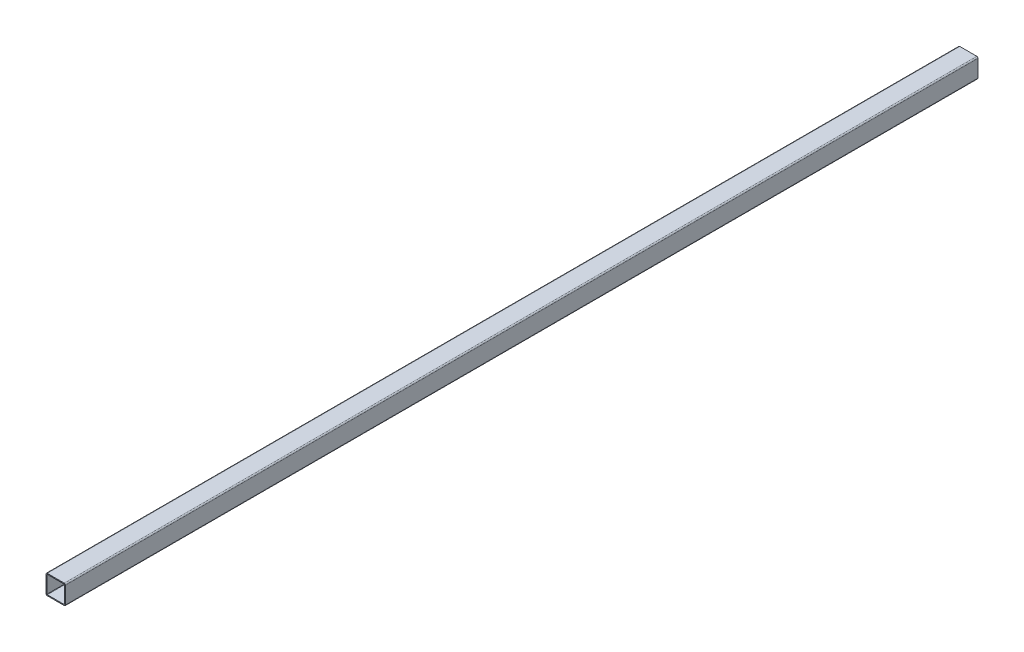
ISO-10303-21;
HEADER;
FILE_DESCRIPTION(('STEP AP214'),'2;1');
FILE_NAME('part.step','',(''),(''),'','','');
FILE_SCHEMA(('AUTOMOTIVE_DESIGN { 1 0 10303 214 1 1 1 1 }'));
ENDSEC;
DATA;
#1=APPLICATION_CONTEXT('core data for automotive mechanical design processes');
#2=APPLICATION_PROTOCOL_DEFINITION('international standard','automotive_design',2000,#1);
#3=PRODUCT_CONTEXT('',#1,'mechanical');
#4=PRODUCT('Part','Part','',(#3));
#5=PRODUCT_RELATED_PRODUCT_CATEGORY('part','',(#4));
#6=PRODUCT_DEFINITION_FORMATION('','',#4);
#7=PRODUCT_DEFINITION_CONTEXT('part definition',#1,'design');
#8=PRODUCT_DEFINITION('design','',#6,#7);
#9=PRODUCT_DEFINITION_SHAPE('','',#8);
#10=(LENGTH_UNIT() NAMED_UNIT(*) SI_UNIT(.MILLI.,.METRE.));
#11=(NAMED_UNIT(*) PLANE_ANGLE_UNIT() SI_UNIT($,.RADIAN.));
#12=(NAMED_UNIT(*) SI_UNIT($,.STERADIAN.) SOLID_ANGLE_UNIT());
#13=UNCERTAINTY_MEASURE_WITH_UNIT(LENGTH_MEASURE(1.E-05),#10,'distance_accuracy_value','');
#14=(GEOMETRIC_REPRESENTATION_CONTEXT(3) GLOBAL_UNCERTAINTY_ASSIGNED_CONTEXT((#13)) GLOBAL_UNIT_ASSIGNED_CONTEXT((#10,
#11,#12)) REPRESENTATION_CONTEXT('',''));
#15=CARTESIAN_POINT('',(0.,0.,0.));
#16=DIRECTION('',(0.,0.,1.));
#17=DIRECTION('',(1.,0.,0.));
#18=AXIS2_PLACEMENT_3D('',#15,#16,#17);
#19=CARTESIAN_POINT('',(14.,-14.,-750.));
#20=DIRECTION('',(0.,0.,1.));
#21=DIRECTION('',(1.,0.,0.));
#22=AXIS2_PLACEMENT_3D('',#19,#20,#21);
#23=CYLINDRICAL_SURFACE('',#22,2.);
#24=DIRECTION('',(0.,0.,1.));
#25=VECTOR('',#24,1.);
#26=CARTESIAN_POINT('',(16.,-14.,-750.));
#27=LINE('',#26,#25);
#28=CARTESIAN_POINT('',(16.,-14.,-750.));
#29=VERTEX_POINT('',#28);
#30=CARTESIAN_POINT('',(16.,-14.,750.));
#31=VERTEX_POINT('',#30);
#32=EDGE_CURVE('E42',#29,#31,#27,.T.);
#33=ORIENTED_EDGE('',*,*,#32,.T.);
#34=CARTESIAN_POINT('',(14.,-14.,750.));
#35=DIRECTION('',(0.,0.,1.));
#36=DIRECTION('',(1.,0.,0.));
#37=AXIS2_PLACEMENT_3D('',#34,#35,#36);
#38=CIRCLE('',#37,2.);
#39=CARTESIAN_POINT('',(14.,-16.,750.));
#40=VERTEX_POINT('',#39);
#41=EDGE_CURVE('E205',#40,#31,#38,.T.);
#42=ORIENTED_EDGE('',*,*,#41,.F.);
#43=DIRECTION('',(0.,0.,1.));
#44=VECTOR('',#43,1.);
#45=CARTESIAN_POINT('',(14.,-16.,-750.));
#46=LINE('',#45,#44);
#47=CARTESIAN_POINT('',(14.,-16.,-750.));
#48=VERTEX_POINT('',#47);
#49=EDGE_CURVE('E11',#48,#40,#46,.T.);
#50=ORIENTED_EDGE('',*,*,#49,.F.);
#51=CARTESIAN_POINT('',(14.,-14.,-750.));
#52=DIRECTION('',(0.,0.,1.));
#53=DIRECTION('',(1.,0.,0.));
#54=AXIS2_PLACEMENT_3D('',#51,#52,#53);
#55=CIRCLE('',#54,2.);
#56=EDGE_CURVE('E265',#48,#29,#55,.T.);
#57=ORIENTED_EDGE('',*,*,#56,.T.);
#58=EDGE_LOOP('',(#33,#42,#50,#57));
#59=FACE_BOUND('',#58,.T.);
#60=ADVANCED_FACE('F39',(#59),#23,.T.);
#61=CARTESIAN_POINT('',(-14.,-16.,-750.));
#62=DIRECTION('',(0.,-1.,0.));
#63=DIRECTION('',(0.,0.,-1.));
#64=AXIS2_PLACEMENT_3D('',#61,#62,#63);
#65=PLANE('',#64);
#66=ORIENTED_EDGE('',*,*,#49,.T.);
#67=DIRECTION('',(1.,0.,0.));
#68=VECTOR('',#67,1.);
#69=CARTESIAN_POINT('',(-14.,-16.,750.));
#70=LINE('',#69,#68);
#71=CARTESIAN_POINT('',(-14.,-16.,750.));
#72=VERTEX_POINT('',#71);
#73=EDGE_CURVE('E233',#72,#40,#70,.T.);
#74=ORIENTED_EDGE('',*,*,#73,.F.);
#75=DIRECTION('',(0.,0.,1.));
#76=VECTOR('',#75,1.);
#77=CARTESIAN_POINT('',(-14.,-16.,-750.));
#78=LINE('',#77,#76);
#79=CARTESIAN_POINT('',(-14.,-16.,-750.));
#80=VERTEX_POINT('',#79);
#81=EDGE_CURVE('E48',#80,#72,#78,.T.);
#82=ORIENTED_EDGE('',*,*,#81,.F.);
#83=DIRECTION('',(1.,0.,0.));
#84=VECTOR('',#83,1.);
#85=CARTESIAN_POINT('',(-14.,-16.,-750.));
#86=LINE('',#85,#84);
#87=EDGE_CURVE('E309',#80,#48,#86,.T.);
#88=ORIENTED_EDGE('',*,*,#87,.T.);
#89=EDGE_LOOP('',(#66,#74,#82,#88));
#90=FACE_BOUND('',#89,.T.);
#91=ADVANCED_FACE('F338',(#90),#65,.T.);
#92=CARTESIAN_POINT('',(-14.,-14.,-750.));
#93=DIRECTION('',(0.,0.,1.));
#94=DIRECTION('',(1.,0.,0.));
#95=AXIS2_PLACEMENT_3D('',#92,#93,#94);
#96=CYLINDRICAL_SURFACE('',#95,2.);
#97=ORIENTED_EDGE('',*,*,#81,.T.);
#98=CARTESIAN_POINT('',(-14.,-14.,750.));
#99=DIRECTION('',(0.,0.,1.));
#100=DIRECTION('',(1.,0.,0.));
#101=AXIS2_PLACEMENT_3D('',#98,#99,#100);
#102=CIRCLE('',#101,2.);
#103=CARTESIAN_POINT('',(-16.,-14.,750.));
#104=VERTEX_POINT('',#103);
#105=EDGE_CURVE('E229',#104,#72,#102,.T.);
#106=ORIENTED_EDGE('',*,*,#105,.F.);
#107=DIRECTION('',(0.,0.,1.));
#108=VECTOR('',#107,1.);
#109=CARTESIAN_POINT('',(-16.,-14.,-750.));
#110=LINE('',#109,#108);
#111=CARTESIAN_POINT('',(-16.,-14.,-750.));
#112=VERTEX_POINT('',#111);
#113=EDGE_CURVE('E315',#112,#104,#110,.T.);
#114=ORIENTED_EDGE('',*,*,#113,.F.);
#115=CARTESIAN_POINT('',(-14.,-14.,-750.));
#116=DIRECTION('',(0.,0.,1.));
#117=DIRECTION('',(1.,0.,0.));
#118=AXIS2_PLACEMENT_3D('',#115,#116,#117);
#119=CIRCLE('',#118,2.);
#120=EDGE_CURVE('E305',#112,#80,#119,.T.);
#121=ORIENTED_EDGE('',*,*,#120,.T.);
#122=EDGE_LOOP('',(#97,#106,#114,#121));
#123=FACE_BOUND('',#122,.T.);
#124=ADVANCED_FACE('F359',(#123),#96,.T.);
#125=CARTESIAN_POINT('',(-16.,-14.,-750.));
#126=DIRECTION('',(-1.,0.,0.));
#127=DIRECTION('',(0.,0.,1.));
#128=AXIS2_PLACEMENT_3D('',#125,#126,#127);
#129=PLANE('',#128);
#130=ORIENTED_EDGE('',*,*,#113,.T.);
#131=DIRECTION('',(0.,-1.,0.));
#132=VECTOR('',#131,1.);
#133=CARTESIAN_POINT('',(-16.,-14.,750.));
#134=LINE('',#133,#132);
#135=CARTESIAN_POINT('',(-16.,14.,750.));
#136=VERTEX_POINT('',#135);
#137=EDGE_CURVE('E225',#136,#104,#134,.T.);
#138=ORIENTED_EDGE('',*,*,#137,.F.);
#139=DIRECTION('',(0.,0.,1.));
#140=VECTOR('',#139,1.);
#141=CARTESIAN_POINT('',(-16.,14.,-750.));
#142=LINE('',#141,#140);
#143=CARTESIAN_POINT('',(-16.,14.,-750.));
#144=VERTEX_POINT('',#143);
#145=EDGE_CURVE('E318',#144,#136,#142,.T.);
#146=ORIENTED_EDGE('',*,*,#145,.F.);
#147=DIRECTION('',(0.,-1.,0.));
#148=VECTOR('',#147,1.);
#149=CARTESIAN_POINT('',(-16.,-14.,-750.));
#150=LINE('',#149,#148);
#151=EDGE_CURVE('E301',#144,#112,#150,.T.);
#152=ORIENTED_EDGE('',*,*,#151,.T.);
#153=EDGE_LOOP('',(#130,#138,#146,#152));
#154=FACE_BOUND('',#153,.T.);
#155=ADVANCED_FACE('F356',(#154),#129,.T.);
#156=CARTESIAN_POINT('',(-14.,14.,-750.));
#157=DIRECTION('',(0.,0.,1.));
#158=DIRECTION('',(1.,0.,0.));
#159=AXIS2_PLACEMENT_3D('',#156,#157,#158);
#160=CYLINDRICAL_SURFACE('',#159,2.);
#161=ORIENTED_EDGE('',*,*,#145,.T.);
#162=CARTESIAN_POINT('',(-14.,14.,750.));
#163=DIRECTION('',(0.,0.,1.));
#164=DIRECTION('',(-1.,0.,0.));
#165=AXIS2_PLACEMENT_3D('',#162,#163,#164);
#166=CIRCLE('',#165,2.);
#167=CARTESIAN_POINT('',(-14.,16.,750.));
#168=VERTEX_POINT('',#167);
#169=EDGE_CURVE('E221',#168,#136,#166,.T.);
#170=ORIENTED_EDGE('',*,*,#169,.F.);
#171=DIRECTION('',(0.,0.,1.));
#172=VECTOR('',#171,1.);
#173=CARTESIAN_POINT('',(-14.,16.,-750.));
#174=LINE('',#173,#172);
#175=CARTESIAN_POINT('',(-14.,16.,-750.));
#176=VERTEX_POINT('',#175);
#177=EDGE_CURVE('E321',#176,#168,#174,.T.);
#178=ORIENTED_EDGE('',*,*,#177,.F.);
#179=CARTESIAN_POINT('',(-14.,14.,-750.));
#180=DIRECTION('',(0.,0.,1.));
#181=DIRECTION('',(-1.,0.,0.));
#182=AXIS2_PLACEMENT_3D('',#179,#180,#181);
#183=CIRCLE('',#182,2.);
#184=EDGE_CURVE('E297',#176,#144,#183,.T.);
#185=ORIENTED_EDGE('',*,*,#184,.T.);
#186=EDGE_LOOP('',(#161,#170,#178,#185));
#187=FACE_BOUND('',#186,.T.);
#188=ADVANCED_FACE('F354',(#187),#160,.T.);
#189=CARTESIAN_POINT('',(-14.,16.,-750.));
#190=DIRECTION('',(0.,1.,0.));
#191=DIRECTION('',(0.,0.,1.));
#192=AXIS2_PLACEMENT_3D('',#189,#190,#191);
#193=PLANE('',#192);
#194=ORIENTED_EDGE('',*,*,#177,.T.);
#195=DIRECTION('',(-1.,0.,0.));
#196=VECTOR('',#195,1.);
#197=CARTESIAN_POINT('',(-14.,16.,750.));
#198=LINE('',#197,#196);
#199=CARTESIAN_POINT('',(14.,16.,750.));
#200=VERTEX_POINT('',#199);
#201=EDGE_CURVE('E217',#200,#168,#198,.T.);
#202=ORIENTED_EDGE('',*,*,#201,.F.);
#203=DIRECTION('',(0.,0.,1.));
#204=VECTOR('',#203,1.);
#205=CARTESIAN_POINT('',(14.,16.,-750.));
#206=LINE('',#205,#204);
#207=CARTESIAN_POINT('',(14.,16.,-750.));
#208=VERTEX_POINT('',#207);
#209=EDGE_CURVE('E324',#208,#200,#206,.T.);
#210=ORIENTED_EDGE('',*,*,#209,.F.);
#211=DIRECTION('',(-1.,0.,0.));
#212=VECTOR('',#211,1.);
#213=CARTESIAN_POINT('',(-14.,16.,-750.));
#214=LINE('',#213,#212);
#215=EDGE_CURVE('E293',#208,#176,#214,.T.);
#216=ORIENTED_EDGE('',*,*,#215,.T.);
#217=EDGE_LOOP('',(#194,#202,#210,#216));
#218=FACE_BOUND('',#217,.T.);
#219=ADVANCED_FACE('F352',(#218),#193,.T.);
#220=CARTESIAN_POINT('',(14.,14.,-750.));
#221=DIRECTION('',(0.,0.,1.));
#222=DIRECTION('',(1.,0.,0.));
#223=AXIS2_PLACEMENT_3D('',#220,#221,#222);
#224=CYLINDRICAL_SURFACE('',#223,2.);
#225=ORIENTED_EDGE('',*,*,#209,.T.);
#226=CARTESIAN_POINT('',(14.,14.,750.));
#227=DIRECTION('',(0.,0.,1.));
#228=DIRECTION('',(1.,0.,0.));
#229=AXIS2_PLACEMENT_3D('',#226,#227,#228);
#230=CIRCLE('',#229,2.);
#231=CARTESIAN_POINT('',(16.,14.,750.));
#232=VERTEX_POINT('',#231);
#233=EDGE_CURVE('E213',#232,#200,#230,.T.);
#234=ORIENTED_EDGE('',*,*,#233,.F.);
#235=DIRECTION('',(0.,0.,1.));
#236=VECTOR('',#235,1.);
#237=CARTESIAN_POINT('',(16.,14.,-750.));
#238=LINE('',#237,#236);
#239=CARTESIAN_POINT('',(16.,14.,-750.));
#240=VERTEX_POINT('',#239);
#241=EDGE_CURVE('E326',#240,#232,#238,.T.);
#242=ORIENTED_EDGE('',*,*,#241,.F.);
#243=CARTESIAN_POINT('',(14.,14.,-750.));
#244=DIRECTION('',(0.,0.,1.));
#245=DIRECTION('',(1.,0.,0.));
#246=AXIS2_PLACEMENT_3D('',#243,#244,#245);
#247=CIRCLE('',#246,2.);
#248=EDGE_CURVE('E289',#240,#208,#247,.T.);
#249=ORIENTED_EDGE('',*,*,#248,.T.);
#250=EDGE_LOOP('',(#225,#234,#242,#249));
#251=FACE_BOUND('',#250,.T.);
#252=ADVANCED_FACE('F348',(#251),#224,.T.);
#253=CARTESIAN_POINT('',(16.,-14.,-750.));
#254=DIRECTION('',(1.,0.,0.));
#255=DIRECTION('',(0.,0.,-1.));
#256=AXIS2_PLACEMENT_3D('',#253,#254,#255);
#257=PLANE('',#256);
#258=ORIENTED_EDGE('',*,*,#241,.T.);
#259=DIRECTION('',(0.,1.,0.));
#260=VECTOR('',#259,1.);
#261=CARTESIAN_POINT('',(16.,-14.,750.));
#262=LINE('',#261,#260);
#263=EDGE_CURVE('E209',#31,#232,#262,.T.);
#264=ORIENTED_EDGE('',*,*,#263,.F.);
#265=ORIENTED_EDGE('',*,*,#32,.F.);
#266=DIRECTION('',(0.,1.,0.));
#267=VECTOR('',#266,1.);
#268=CARTESIAN_POINT('',(16.,-14.,-750.));
#269=LINE('',#268,#267);
#270=EDGE_CURVE('E285',#29,#240,#269,.T.);
#271=ORIENTED_EDGE('',*,*,#270,.T.);
#272=EDGE_LOOP('',(#258,#264,#265,#271));
#273=FACE_BOUND('',#272,.T.);
#274=ADVANCED_FACE('F332',(#273),#257,.T.);
#275=CARTESIAN_POINT('',(14.,-14.,-750.));
#276=DIRECTION('',(0.,0.,1.));
#277=DIRECTION('',(1.,0.,0.));
#278=AXIS2_PLACEMENT_3D('',#275,#276,#277);
#279=PLANE('',#278);
#280=DIRECTION('',(-1.,0.,0.));
#281=VECTOR('',#280,1.);
#282=CARTESIAN_POINT('',(-14.,14.48,-750.));
#283=LINE('',#282,#281);
#284=CARTESIAN_POINT('',(14.,14.48,-750.));
#285=VERTEX_POINT('',#284);
#286=CARTESIAN_POINT('',(-14.,14.48,-750.));
#287=VERTEX_POINT('',#286);
#288=EDGE_CURVE('E166',#285,#287,#283,.T.);
#289=ORIENTED_EDGE('',*,*,#288,.T.);
#290=CARTESIAN_POINT('',(-14.,14.,-750.));
#291=DIRECTION('',(0.,0.,1.));
#292=DIRECTION('',(-1.,0.,0.));
#293=AXIS2_PLACEMENT_3D('',#290,#291,#292);
#294=CIRCLE('',#293,0.48);
#295=CARTESIAN_POINT('',(-14.48,14.,-750.));
#296=VERTEX_POINT('',#295);
#297=EDGE_CURVE('E237',#287,#296,#294,.T.);
#298=ORIENTED_EDGE('',*,*,#297,.T.);
#299=DIRECTION('',(0.,-1.,0.));
#300=VECTOR('',#299,1.);
#301=CARTESIAN_POINT('',(-14.48,-14.,-750.));
#302=LINE('',#301,#300);
#303=CARTESIAN_POINT('',(-14.48,-14.,-750.));
#304=VERTEX_POINT('',#303);
#305=EDGE_CURVE('E160',#296,#304,#302,.T.);
#306=ORIENTED_EDGE('',*,*,#305,.T.);
#307=CARTESIAN_POINT('',(-14.,-14.,-750.));
#308=DIRECTION('',(0.,0.,1.));
#309=DIRECTION('',(1.,0.,0.));
#310=AXIS2_PLACEMENT_3D('',#307,#308,#309);
#311=CIRCLE('',#310,0.48);
#312=CARTESIAN_POINT('',(-14.,-14.48,-750.));
#313=VERTEX_POINT('',#312);
#314=EDGE_CURVE('E56',#304,#313,#311,.T.);
#315=ORIENTED_EDGE('',*,*,#314,.T.);
#316=DIRECTION('',(1.,0.,0.));
#317=VECTOR('',#316,1.);
#318=CARTESIAN_POINT('',(-14.,-14.48,-750.));
#319=LINE('',#318,#317);
#320=CARTESIAN_POINT('',(14.,-14.48,-750.));
#321=VERTEX_POINT('',#320);
#322=EDGE_CURVE('E244',#313,#321,#319,.T.);
#323=ORIENTED_EDGE('',*,*,#322,.T.);
#324=CARTESIAN_POINT('',(14.,-14.,-750.));
#325=DIRECTION('',(0.,0.,1.));
#326=DIRECTION('',(1.,0.,0.));
#327=AXIS2_PLACEMENT_3D('',#324,#325,#326);
#328=CIRCLE('',#327,0.48);
#329=CARTESIAN_POINT('',(14.48,-14.,-750.));
#330=VERTEX_POINT('',#329);
#331=EDGE_CURVE('E248',#321,#330,#328,.T.);
#332=ORIENTED_EDGE('',*,*,#331,.T.);
#333=DIRECTION('',(0.,1.,0.));
#334=VECTOR('',#333,1.);
#335=CARTESIAN_POINT('',(14.48,-14.,-750.));
#336=LINE('',#335,#334);
#337=CARTESIAN_POINT('',(14.48,14.,-750.));
#338=VERTEX_POINT('',#337);
#339=EDGE_CURVE('E252',#330,#338,#336,.T.);
#340=ORIENTED_EDGE('',*,*,#339,.T.);
#341=CARTESIAN_POINT('',(14.,14.,-750.));
#342=DIRECTION('',(0.,0.,1.));
#343=DIRECTION('',(1.,0.,0.));
#344=AXIS2_PLACEMENT_3D('',#341,#342,#343);
#345=CIRCLE('',#344,0.48);
#346=EDGE_CURVE('E256',#338,#285,#345,.T.);
#347=ORIENTED_EDGE('',*,*,#346,.T.);
#348=EDGE_LOOP('',(#289,#298,#306,#315,#323,#332,#340,#347));
#349=FACE_BOUND('',#348,.T.);
#350=ORIENTED_EDGE('',*,*,#56,.F.);
#351=ORIENTED_EDGE('',*,*,#87,.F.);
#352=ORIENTED_EDGE('',*,*,#120,.F.);
#353=ORIENTED_EDGE('',*,*,#151,.F.);
#354=ORIENTED_EDGE('',*,*,#184,.F.);
#355=ORIENTED_EDGE('',*,*,#215,.F.);
#356=ORIENTED_EDGE('',*,*,#248,.F.);
#357=ORIENTED_EDGE('',*,*,#270,.F.);
#358=EDGE_LOOP('',(#350,#351,#352,#353,#354,#355,#356,#357));
#359=FACE_BOUND('',#358,.T.);
#360=ADVANCED_FACE('F342',(#349,#359),#279,.F.);
#361=CARTESIAN_POINT('',(-14.,14.,-750.));
#362=DIRECTION('',(0.,0.,1.));
#363=DIRECTION('',(1.,0.,0.));
#364=AXIS2_PLACEMENT_3D('',#361,#362,#363);
#365=CYLINDRICAL_SURFACE('',#364,0.48);
#366=DIRECTION('',(0.,0.,1.));
#367=VECTOR('',#366,1.);
#368=CARTESIAN_POINT('',(-14.,14.48,-750.));
#369=LINE('',#368,#367);
#370=CARTESIAN_POINT('',(-14.,14.48,750.));
#371=VERTEX_POINT('',#370);
#372=EDGE_CURVE('E171',#287,#371,#369,.T.);
#373=ORIENTED_EDGE('',*,*,#372,.T.);
#374=CARTESIAN_POINT('',(-14.,14.,750.));
#375=DIRECTION('',(0.,0.,1.));
#376=DIRECTION('',(-1.,0.,0.));
#377=AXIS2_PLACEMENT_3D('',#374,#375,#376);
#378=CIRCLE('',#377,0.48);
#379=CARTESIAN_POINT('',(-14.48,14.,750.));
#380=VERTEX_POINT('',#379);
#381=EDGE_CURVE('E169',#371,#380,#378,.T.);
#382=ORIENTED_EDGE('',*,*,#381,.T.);
#383=DIRECTION('',(0.,0.,1.));
#384=VECTOR('',#383,1.);
#385=CARTESIAN_POINT('',(-14.48,14.,-750.));
#386=LINE('',#385,#384);
#387=EDGE_CURVE('E153',#296,#380,#386,.T.);
#388=ORIENTED_EDGE('',*,*,#387,.F.);
#389=ORIENTED_EDGE('',*,*,#297,.F.);
#390=EDGE_LOOP('',(#373,#382,#388,#389));
#391=FACE_BOUND('',#390,.T.);
#392=ADVANCED_FACE('F170',(#391),#365,.F.);
#393=CARTESIAN_POINT('',(-14.,14.48,-750.));
#394=DIRECTION('',(0.,1.,0.));
#395=DIRECTION('',(0.,0.,1.));
#396=AXIS2_PLACEMENT_3D('',#393,#394,#395);
#397=PLANE('',#396);
#398=DIRECTION('',(0.,0.,1.));
#399=VECTOR('',#398,1.);
#400=CARTESIAN_POINT('',(14.,14.48,-750.));
#401=LINE('',#400,#399);
#402=CARTESIAN_POINT('',(14.,14.48,750.));
#403=VERTEX_POINT('',#402);
#404=EDGE_CURVE('E266',#285,#403,#401,.T.);
#405=ORIENTED_EDGE('',*,*,#404,.T.);
#406=DIRECTION('',(-1.,0.,0.));
#407=VECTOR('',#406,1.);
#408=CARTESIAN_POINT('',(-14.,14.48,750.));
#409=LINE('',#408,#407);
#410=EDGE_CURVE('E202',#403,#371,#409,.T.);
#411=ORIENTED_EDGE('',*,*,#410,.T.);
#412=ORIENTED_EDGE('',*,*,#372,.F.);
#413=ORIENTED_EDGE('',*,*,#288,.F.);
#414=EDGE_LOOP('',(#405,#411,#412,#413));
#415=FACE_BOUND('',#414,.T.);
#416=ADVANCED_FACE('F434',(#415),#397,.F.);
#417=CARTESIAN_POINT('',(14.,14.,-750.));
#418=DIRECTION('',(0.,0.,1.));
#419=DIRECTION('',(1.,0.,0.));
#420=AXIS2_PLACEMENT_3D('',#417,#418,#419);
#421=CYLINDRICAL_SURFACE('',#420,0.48);
#422=DIRECTION('',(0.,0.,1.));
#423=VECTOR('',#422,1.);
#424=CARTESIAN_POINT('',(14.48,14.,-750.));
#425=LINE('',#424,#423);
#426=CARTESIAN_POINT('',(14.48,14.,750.));
#427=VERTEX_POINT('',#426);
#428=EDGE_CURVE('E269',#338,#427,#425,.T.);
#429=ORIENTED_EDGE('',*,*,#428,.T.);
#430=CARTESIAN_POINT('',(14.,14.,750.));
#431=DIRECTION('',(0.,0.,1.));
#432=DIRECTION('',(1.,0.,0.));
#433=AXIS2_PLACEMENT_3D('',#430,#431,#432);
#434=CIRCLE('',#433,0.48);
#435=EDGE_CURVE('E198',#427,#403,#434,.T.);
#436=ORIENTED_EDGE('',*,*,#435,.T.);
#437=ORIENTED_EDGE('',*,*,#404,.F.);
#438=ORIENTED_EDGE('',*,*,#346,.F.);
#439=EDGE_LOOP('',(#429,#436,#437,#438));
#440=FACE_BOUND('',#439,.T.);
#441=ADVANCED_FACE('F443',(#440),#421,.F.);
#442=CARTESIAN_POINT('',(14.48,-14.,-750.));
#443=DIRECTION('',(1.,0.,0.));
#444=DIRECTION('',(0.,0.,-1.));
#445=AXIS2_PLACEMENT_3D('',#442,#443,#444);
#446=PLANE('',#445);
#447=DIRECTION('',(0.,0.,1.));
#448=VECTOR('',#447,1.);
#449=CARTESIAN_POINT('',(14.48,-14.,-750.));
#450=LINE('',#449,#448);
#451=CARTESIAN_POINT('',(14.48,-14.,750.));
#452=VERTEX_POINT('',#451);
#453=EDGE_CURVE('E272',#330,#452,#450,.T.);
#454=ORIENTED_EDGE('',*,*,#453,.T.);
#455=DIRECTION('',(0.,1.,0.));
#456=VECTOR('',#455,1.);
#457=CARTESIAN_POINT('',(14.48,-14.,750.));
#458=LINE('',#457,#456);
#459=EDGE_CURVE('E194',#452,#427,#458,.T.);
#460=ORIENTED_EDGE('',*,*,#459,.T.);
#461=ORIENTED_EDGE('',*,*,#428,.F.);
#462=ORIENTED_EDGE('',*,*,#339,.F.);
#463=EDGE_LOOP('',(#454,#460,#461,#462));
#464=FACE_BOUND('',#463,.T.);
#465=ADVANCED_FACE('F453',(#464),#446,.F.);
#466=CARTESIAN_POINT('',(14.,-14.,-750.));
#467=DIRECTION('',(0.,0.,1.));
#468=DIRECTION('',(1.,0.,0.));
#469=AXIS2_PLACEMENT_3D('',#466,#467,#468);
#470=CYLINDRICAL_SURFACE('',#469,0.48);
#471=DIRECTION('',(0.,0.,1.));
#472=VECTOR('',#471,1.);
#473=CARTESIAN_POINT('',(14.,-14.48,-750.));
#474=LINE('',#473,#472);
#475=CARTESIAN_POINT('',(14.,-14.48,750.));
#476=VERTEX_POINT('',#475);
#477=EDGE_CURVE('E275',#321,#476,#474,.T.);
#478=ORIENTED_EDGE('',*,*,#477,.T.);
#479=CARTESIAN_POINT('',(14.,-14.,750.));
#480=DIRECTION('',(0.,0.,1.));
#481=DIRECTION('',(1.,0.,0.));
#482=AXIS2_PLACEMENT_3D('',#479,#480,#481);
#483=CIRCLE('',#482,0.48);
#484=EDGE_CURVE('E190',#476,#452,#483,.T.);
#485=ORIENTED_EDGE('',*,*,#484,.T.);
#486=ORIENTED_EDGE('',*,*,#453,.F.);
#487=ORIENTED_EDGE('',*,*,#331,.F.);
#488=EDGE_LOOP('',(#478,#485,#486,#487));
#489=FACE_BOUND('',#488,.T.);
#490=ADVANCED_FACE('F463',(#489),#470,.F.);
#491=CARTESIAN_POINT('',(-14.,-14.48,-750.));
#492=DIRECTION('',(0.,-1.,0.));
#493=DIRECTION('',(0.,0.,-1.));
#494=AXIS2_PLACEMENT_3D('',#491,#492,#493);
#495=PLANE('',#494);
#496=DIRECTION('',(0.,0.,1.));
#497=VECTOR('',#496,1.);
#498=CARTESIAN_POINT('',(-14.,-14.48,-750.));
#499=LINE('',#498,#497);
#500=CARTESIAN_POINT('',(-14.,-14.48,750.));
#501=VERTEX_POINT('',#500);
#502=EDGE_CURVE('E278',#313,#501,#499,.T.);
#503=ORIENTED_EDGE('',*,*,#502,.T.);
#504=DIRECTION('',(1.,0.,0.));
#505=VECTOR('',#504,1.);
#506=CARTESIAN_POINT('',(-14.,-14.48,750.));
#507=LINE('',#506,#505);
#508=EDGE_CURVE('E184',#501,#476,#507,.T.);
#509=ORIENTED_EDGE('',*,*,#508,.T.);
#510=ORIENTED_EDGE('',*,*,#477,.F.);
#511=ORIENTED_EDGE('',*,*,#322,.F.);
#512=EDGE_LOOP('',(#503,#509,#510,#511));
#513=FACE_BOUND('',#512,.T.);
#514=ADVANCED_FACE('F473',(#513),#495,.F.);
#515=CARTESIAN_POINT('',(-14.,-14.,-750.));
#516=DIRECTION('',(0.,0.,1.));
#517=DIRECTION('',(1.,0.,0.));
#518=AXIS2_PLACEMENT_3D('',#515,#516,#517);
#519=CYLINDRICAL_SURFACE('',#518,0.48);
#520=DIRECTION('',(0.,0.,1.));
#521=VECTOR('',#520,1.);
#522=CARTESIAN_POINT('',(-14.48,-14.,-750.));
#523=LINE('',#522,#521);
#524=CARTESIAN_POINT('',(-14.48,-14.,750.));
#525=VERTEX_POINT('',#524);
#526=EDGE_CURVE('E165',#304,#525,#523,.T.);
#527=ORIENTED_EDGE('',*,*,#526,.T.);
#528=CARTESIAN_POINT('',(-14.,-14.,750.));
#529=DIRECTION('',(0.,0.,1.));
#530=DIRECTION('',(1.,0.,0.));
#531=AXIS2_PLACEMENT_3D('',#528,#529,#530);
#532=CIRCLE('',#531,0.48);
#533=EDGE_CURVE('E180',#525,#501,#532,.T.);
#534=ORIENTED_EDGE('',*,*,#533,.T.);
#535=ORIENTED_EDGE('',*,*,#502,.F.);
#536=ORIENTED_EDGE('',*,*,#314,.F.);
#537=EDGE_LOOP('',(#527,#534,#535,#536));
#538=FACE_BOUND('',#537,.T.);
#539=ADVANCED_FACE('F483',(#538),#519,.F.);
#540=CARTESIAN_POINT('',(-14.48,-14.,-750.));
#541=DIRECTION('',(-1.,0.,0.));
#542=DIRECTION('',(0.,0.,1.));
#543=AXIS2_PLACEMENT_3D('',#540,#541,#542);
#544=PLANE('',#543);
#545=ORIENTED_EDGE('',*,*,#387,.T.);
#546=DIRECTION('',(0.,-1.,0.));
#547=VECTOR('',#546,1.);
#548=CARTESIAN_POINT('',(-14.48,-14.,750.));
#549=LINE('',#548,#547);
#550=EDGE_CURVE('E157',#380,#525,#549,.T.);
#551=ORIENTED_EDGE('',*,*,#550,.T.);
#552=ORIENTED_EDGE('',*,*,#526,.F.);
#553=ORIENTED_EDGE('',*,*,#305,.F.);
#554=EDGE_LOOP('',(#545,#551,#552,#553));
#555=FACE_BOUND('',#554,.T.);
#556=ADVANCED_FACE('F155',(#555),#544,.F.);
#557=CARTESIAN_POINT('',(14.,-14.,750.));
#558=DIRECTION('',(0.,0.,1.));
#559=DIRECTION('',(1.,0.,0.));
#560=AXIS2_PLACEMENT_3D('',#557,#558,#559);
#561=PLANE('',#560);
#562=ORIENTED_EDGE('',*,*,#41,.T.);
#563=ORIENTED_EDGE('',*,*,#263,.T.);
#564=ORIENTED_EDGE('',*,*,#233,.T.);
#565=ORIENTED_EDGE('',*,*,#201,.T.);
#566=ORIENTED_EDGE('',*,*,#169,.T.);
#567=ORIENTED_EDGE('',*,*,#137,.T.);
#568=ORIENTED_EDGE('',*,*,#105,.T.);
#569=ORIENTED_EDGE('',*,*,#73,.T.);
#570=EDGE_LOOP('',(#562,#563,#564,#565,#566,#567,#568,#569));
#571=FACE_BOUND('',#570,.T.);
#572=ORIENTED_EDGE('',*,*,#550,.F.);
#573=ORIENTED_EDGE('',*,*,#381,.F.);
#574=ORIENTED_EDGE('',*,*,#410,.F.);
#575=ORIENTED_EDGE('',*,*,#435,.F.);
#576=ORIENTED_EDGE('',*,*,#459,.F.);
#577=ORIENTED_EDGE('',*,*,#484,.F.);
#578=ORIENTED_EDGE('',*,*,#508,.F.);
#579=ORIENTED_EDGE('',*,*,#533,.F.);
#580=EDGE_LOOP('',(#572,#573,#574,#575,#576,#577,#578,#579));
#581=FACE_BOUND('',#580,.T.);
#582=ADVANCED_FACE('F177',(#571,#581),#561,.T.);
#583=CLOSED_SHELL('',(#60,#91,#124,#155,#188,#219,#252,#274,#360,#392,#416,#441,#465,#490,#514,
#539,#556,#582));
#584=MANIFOLD_SOLID_BREP('B2',#583);
#585=ADVANCED_BREP_SHAPE_REPRESENTATION('',(#18,#584),#14);
#586=SHAPE_DEFINITION_REPRESENTATION(#9,#585);
ENDSEC;
END-ISO-10303-21;
